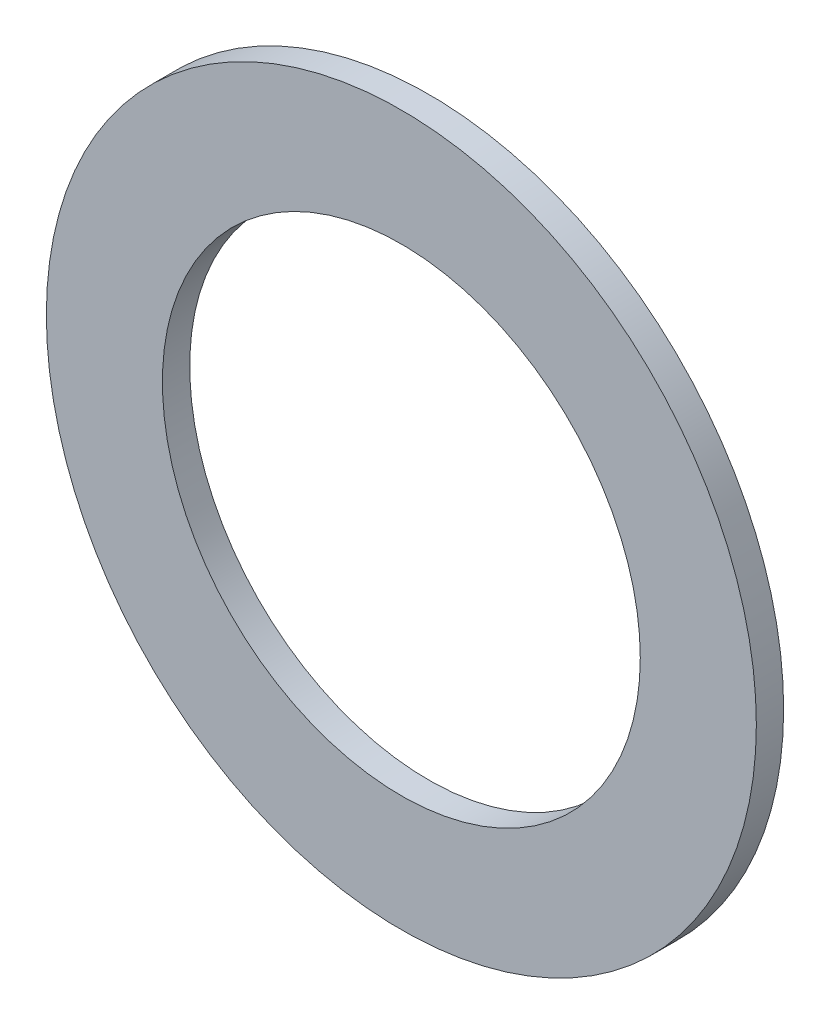
ISO-10303-21;
HEADER;
FILE_DESCRIPTION(('STEP AP214'),'2;1');
FILE_NAME('part.step','',(''),(''),'','','');
FILE_SCHEMA(('AUTOMOTIVE_DESIGN { 1 0 10303 214 1 1 1 1 }'));
ENDSEC;
DATA;
#1=APPLICATION_CONTEXT('core data for automotive mechanical design processes');
#2=APPLICATION_PROTOCOL_DEFINITION('international standard','automotive_design',2000,#1);
#3=PRODUCT_CONTEXT('',#1,'mechanical');
#4=PRODUCT('Part','Part','',(#3));
#5=PRODUCT_RELATED_PRODUCT_CATEGORY('part','',(#4));
#6=PRODUCT_DEFINITION_FORMATION('','',#4);
#7=PRODUCT_DEFINITION_CONTEXT('part definition',#1,'design');
#8=PRODUCT_DEFINITION('design','',#6,#7);
#9=PRODUCT_DEFINITION_SHAPE('','',#8);
#10=(LENGTH_UNIT() NAMED_UNIT(*) SI_UNIT(.MILLI.,.METRE.));
#11=(NAMED_UNIT(*) PLANE_ANGLE_UNIT() SI_UNIT($,.RADIAN.));
#12=(NAMED_UNIT(*) SI_UNIT($,.STERADIAN.) SOLID_ANGLE_UNIT());
#13=UNCERTAINTY_MEASURE_WITH_UNIT(LENGTH_MEASURE(1.E-05),#10,'distance_accuracy_value','');
#14=(GEOMETRIC_REPRESENTATION_CONTEXT(3) GLOBAL_UNCERTAINTY_ASSIGNED_CONTEXT((#13)) GLOBAL_UNIT_ASSIGNED_CONTEXT((#10,
#11,#12)) REPRESENTATION_CONTEXT('',''));
#15=CARTESIAN_POINT('',(0.,0.,0.));
#16=DIRECTION('',(0.,0.,1.));
#17=DIRECTION('',(1.,0.,0.));
#18=AXIS2_PLACEMENT_3D('',#15,#16,#17);
#19=CARTESIAN_POINT('',(0.,0.,2.));
#20=DIRECTION('',(0.,0.,1.));
#21=DIRECTION('',(1.,0.,0.));
#22=AXIS2_PLACEMENT_3D('',#19,#20,#21);
#23=PLANE('',#22);
#24=CARTESIAN_POINT('',(0.,0.,2.));
#25=DIRECTION('',(0.,0.,1.));
#26=DIRECTION('',(1.,0.,0.));
#27=AXIS2_PLACEMENT_3D('',#24,#25,#26);
#28=CIRCLE('',#27,26.);
#29=CARTESIAN_POINT('',(26.,0.,2.));
#30=VERTEX_POINT('',#29);
#31=EDGE_CURVE('E12',#30,#30,#28,.T.);
#32=ORIENTED_EDGE('',*,*,#31,.T.);
#33=EDGE_LOOP('',(#32));
#34=FACE_BOUND('',#33,.T.);
#35=CARTESIAN_POINT('',(0.,0.,2.));
#36=DIRECTION('',(0.,0.,1.));
#37=DIRECTION('',(1.,0.,0.));
#38=AXIS2_PLACEMENT_3D('',#35,#36,#37);
#39=CIRCLE('',#38,17.5);
#40=CARTESIAN_POINT('',(17.5,0.,2.));
#41=VERTEX_POINT('',#40);
#42=EDGE_CURVE('E55',#41,#41,#39,.T.);
#43=ORIENTED_EDGE('',*,*,#42,.F.);
#44=EDGE_LOOP('',(#43));
#45=FACE_BOUND('',#44,.T.);
#46=ADVANCED_FACE('F44',(#34,#45),#23,.T.);
#47=CARTESIAN_POINT('',(0.,0.,0.));
#48=DIRECTION('',(0.,0.,1.));
#49=DIRECTION('',(1.,0.,0.));
#50=AXIS2_PLACEMENT_3D('',#47,#48,#49);
#51=PLANE('',#50);
#52=CARTESIAN_POINT('',(0.,0.,0.));
#53=DIRECTION('',(0.,0.,1.));
#54=DIRECTION('',(1.,0.,0.));
#55=AXIS2_PLACEMENT_3D('',#52,#53,#54);
#56=CIRCLE('',#55,26.);
#57=CARTESIAN_POINT('',(26.,0.,0.));
#58=VERTEX_POINT('',#57);
#59=EDGE_CURVE('E48',#58,#58,#56,.T.);
#60=ORIENTED_EDGE('',*,*,#59,.F.);
#61=EDGE_LOOP('',(#60));
#62=FACE_BOUND('',#61,.T.);
#63=CARTESIAN_POINT('',(0.,0.,0.));
#64=DIRECTION('',(0.,0.,1.));
#65=DIRECTION('',(1.,0.,0.));
#66=AXIS2_PLACEMENT_3D('',#63,#64,#65);
#67=CIRCLE('',#66,17.5);
#68=CARTESIAN_POINT('',(17.5,0.,0.));
#69=VERTEX_POINT('',#68);
#70=EDGE_CURVE('E57',#69,#69,#67,.T.);
#71=ORIENTED_EDGE('',*,*,#70,.T.);
#72=EDGE_LOOP('',(#71));
#73=FACE_BOUND('',#72,.T.);
#74=ADVANCED_FACE('F67',(#62,#73),#51,.F.);
#75=CARTESIAN_POINT('',(0.,0.,2.));
#76=DIRECTION('',(0.,0.,-1.));
#77=DIRECTION('',(-1.,0.,0.));
#78=AXIS2_PLACEMENT_3D('',#75,#76,#77);
#79=CYLINDRICAL_SURFACE('',#78,26.);
#80=ORIENTED_EDGE('',*,*,#31,.F.);
#81=EDGE_LOOP('',(#80));
#82=FACE_BOUND('',#81,.T.);
#83=ORIENTED_EDGE('',*,*,#59,.T.);
#84=EDGE_LOOP('',(#83));
#85=FACE_BOUND('',#84,.T.);
#86=ADVANCED_FACE('F46',(#82,#85),#79,.T.);
#87=CARTESIAN_POINT('',(0.,0.,2.));
#88=DIRECTION('',(0.,0.,-1.));
#89=DIRECTION('',(-1.,0.,0.));
#90=AXIS2_PLACEMENT_3D('',#87,#88,#89);
#91=CYLINDRICAL_SURFACE('',#90,17.5);
#92=ORIENTED_EDGE('',*,*,#42,.T.);
#93=EDGE_LOOP('',(#92));
#94=FACE_BOUND('',#93,.T.);
#95=ORIENTED_EDGE('',*,*,#70,.F.);
#96=EDGE_LOOP('',(#95));
#97=FACE_BOUND('',#96,.T.);
#98=ADVANCED_FACE('F63',(#94,#97),#91,.F.);
#99=CLOSED_SHELL('',(#46,#74,#86,#98));
#100=MANIFOLD_SOLID_BREP('B2',#99);
#101=ADVANCED_BREP_SHAPE_REPRESENTATION('',(#18,#100),#14);
#102=SHAPE_DEFINITION_REPRESENTATION(#9,#101);
ENDSEC;
END-ISO-10303-21;
